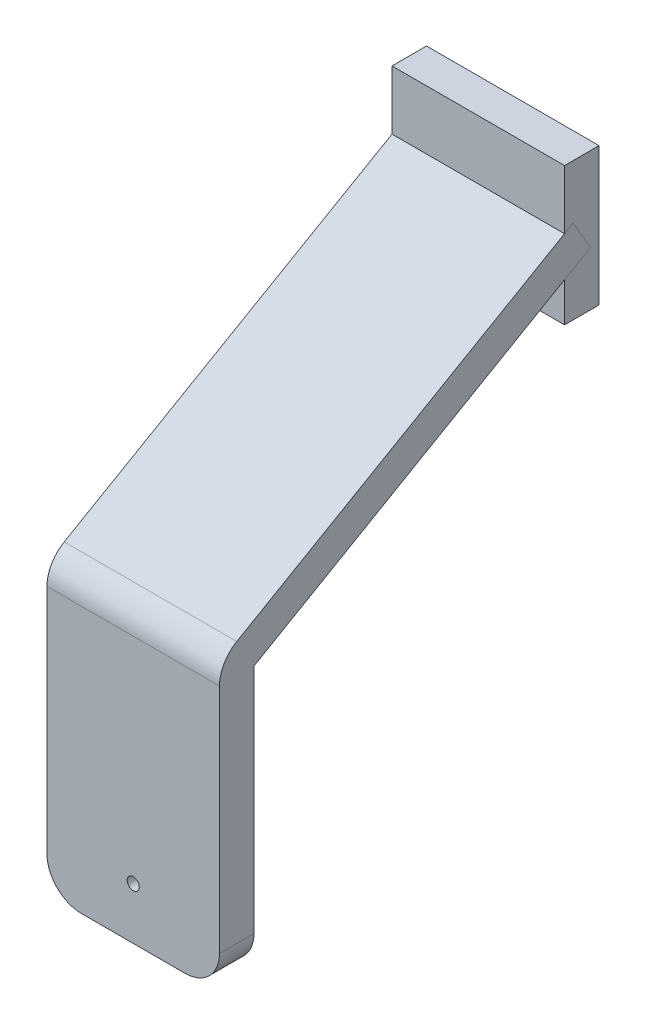
ISO-10303-21;
HEADER;
FILE_DESCRIPTION(('STEP AP214'),'2;1');
FILE_NAME('part.step','',(''),(''),'','','');
FILE_SCHEMA(('AUTOMOTIVE_DESIGN { 1 0 10303 214 1 1 1 1 }'));
ENDSEC;
DATA;
#1=APPLICATION_CONTEXT('core data for automotive mechanical design processes');
#2=APPLICATION_PROTOCOL_DEFINITION('international standard','automotive_design',2000,#1);
#3=PRODUCT_CONTEXT('',#1,'mechanical');
#4=PRODUCT('Part','Part','',(#3));
#5=PRODUCT_RELATED_PRODUCT_CATEGORY('part','',(#4));
#6=PRODUCT_DEFINITION_FORMATION('','',#4);
#7=PRODUCT_DEFINITION_CONTEXT('part definition',#1,'design');
#8=PRODUCT_DEFINITION('design','',#6,#7);
#9=PRODUCT_DEFINITION_SHAPE('','',#8);
#10=(LENGTH_UNIT() NAMED_UNIT(*) SI_UNIT(.MILLI.,.METRE.));
#11=(NAMED_UNIT(*) PLANE_ANGLE_UNIT() SI_UNIT($,.RADIAN.));
#12=(NAMED_UNIT(*) SI_UNIT($,.STERADIAN.) SOLID_ANGLE_UNIT());
#13=UNCERTAINTY_MEASURE_WITH_UNIT(LENGTH_MEASURE(1.E-05),#10,'distance_accuracy_value','');
#14=(GEOMETRIC_REPRESENTATION_CONTEXT(3) GLOBAL_UNCERTAINTY_ASSIGNED_CONTEXT((#13)) GLOBAL_UNIT_ASSIGNED_CONTEXT((#10,
#11,#12)) REPRESENTATION_CONTEXT('',''));
#15=CARTESIAN_POINT('',(0.,0.,0.));
#16=DIRECTION('',(0.,0.,1.));
#17=DIRECTION('',(1.,0.,0.));
#18=AXIS2_PLACEMENT_3D('',#15,#16,#17);
#19=CARTESIAN_POINT('',(50.,117.735026918962,-105.));
#20=DIRECTION('',(0.,0.,1.));
#21=DIRECTION('',(0.,-1.,0.));
#22=AXIS2_PLACEMENT_3D('',#19,#20,#21);
#23=PLANE('',#22);
#24=DIRECTION('',(0.,1.,0.));
#25=VECTOR('',#24,1.);
#26=CARTESIAN_POINT('',(0.,117.735026918962,-105.));
#27=LINE('',#26,#25);
#28=CARTESIAN_POINT('',(0.,117.735026918962,-105.));
#29=VERTEX_POINT('',#28);
#30=CARTESIAN_POINT('',(0.,157.735026918962,-105.));
#31=VERTEX_POINT('',#30);
#32=EDGE_CURVE('E163',#29,#31,#27,.T.);
#33=ORIENTED_EDGE('',*,*,#32,.T.);
#34=DIRECTION('',(-1.,0.,0.));
#35=VECTOR('',#34,1.);
#36=CARTESIAN_POINT('',(50.,157.735026918962,-105.));
#37=LINE('',#36,#35);
#38=CARTESIAN_POINT('',(50.,157.735026918962,-105.));
#39=VERTEX_POINT('',#38);
#40=EDGE_CURVE('E13',#39,#31,#37,.T.);
#41=ORIENTED_EDGE('',*,*,#40,.F.);
#42=DIRECTION('',(0.,1.,0.));
#43=VECTOR('',#42,1.);
#44=CARTESIAN_POINT('',(50.,117.735026918962,-105.));
#45=LINE('',#44,#43);
#46=CARTESIAN_POINT('',(50.,117.735026918962,-105.));
#47=VERTEX_POINT('',#46);
#48=EDGE_CURVE('E143',#47,#39,#45,.T.);
#49=ORIENTED_EDGE('',*,*,#48,.F.);
#50=DIRECTION('',(-1.,0.,0.));
#51=VECTOR('',#50,1.);
#52=CARTESIAN_POINT('',(50.,117.735026918962,-105.));
#53=LINE('',#52,#51);
#54=EDGE_CURVE('E116',#47,#29,#53,.T.);
#55=ORIENTED_EDGE('',*,*,#54,.T.);
#56=EDGE_LOOP('',(#33,#41,#49,#55));
#57=FACE_BOUND('',#56,.T.);
#58=ADVANCED_FACE('F101',(#57),#23,.F.);
#59=CARTESIAN_POINT('',(50.,157.735026918962,-95.));
#60=DIRECTION('',(0.,1.,0.));
#61=DIRECTION('',(0.,0.,1.));
#62=AXIS2_PLACEMENT_3D('',#59,#60,#61);
#63=PLANE('',#62);
#64=DIRECTION('',(0.,0.,-1.));
#65=VECTOR('',#64,1.);
#66=CARTESIAN_POINT('',(0.,157.735026918962,-95.));
#67=LINE('',#66,#65);
#68=CARTESIAN_POINT('',(0.,157.735026918962,-95.));
#69=VERTEX_POINT('',#68);
#70=EDGE_CURVE('E147',#69,#31,#67,.T.);
#71=ORIENTED_EDGE('',*,*,#70,.F.);
#72=DIRECTION('',(-1.,0.,0.));
#73=VECTOR('',#72,1.);
#74=CARTESIAN_POINT('',(50.,157.735026918962,-95.));
#75=LINE('',#74,#73);
#76=CARTESIAN_POINT('',(50.,157.735026918962,-95.));
#77=VERTEX_POINT('',#76);
#78=EDGE_CURVE('E108',#77,#69,#75,.T.);
#79=ORIENTED_EDGE('',*,*,#78,.F.);
#80=DIRECTION('',(0.,0.,-1.));
#81=VECTOR('',#80,1.);
#82=CARTESIAN_POINT('',(50.,157.735026918962,-95.));
#83=LINE('',#82,#81);
#84=EDGE_CURVE('E146',#77,#39,#83,.T.);
#85=ORIENTED_EDGE('',*,*,#84,.T.);
#86=ORIENTED_EDGE('',*,*,#40,.T.);
#87=EDGE_LOOP('',(#71,#79,#85,#86));
#88=FACE_BOUND('',#87,.T.);
#89=ADVANCED_FACE('F150',(#88),#63,.T.);
#90=CARTESIAN_POINT('',(50.,117.735026918962,-95.));
#91=DIRECTION('',(0.,0.,1.));
#92=DIRECTION('',(0.,-1.,0.));
#93=AXIS2_PLACEMENT_3D('',#90,#91,#92);
#94=PLANE('',#93);
#95=DIRECTION('',(0.,1.,0.));
#96=VECTOR('',#95,1.);
#97=CARTESIAN_POINT('',(0.,117.735026918962,-95.));
#98=LINE('',#97,#96);
#99=CARTESIAN_POINT('',(0.,117.735026918962,-95.));
#100=VERTEX_POINT('',#99);
#101=EDGE_CURVE('E170',#100,#69,#98,.T.);
#102=ORIENTED_EDGE('',*,*,#101,.F.);
#103=DIRECTION('',(-1.,0.,0.));
#104=VECTOR('',#103,1.);
#105=CARTESIAN_POINT('',(50.,117.735026918962,-95.));
#106=LINE('',#105,#104);
#107=CARTESIAN_POINT('',(50.,117.735026918962,-95.));
#108=VERTEX_POINT('',#107);
#109=EDGE_CURVE('E128',#108,#100,#106,.T.);
#110=ORIENTED_EDGE('',*,*,#109,.F.);
#111=DIRECTION('',(0.,1.,0.));
#112=VECTOR('',#111,1.);
#113=CARTESIAN_POINT('',(50.,117.735026918962,-95.));
#114=LINE('',#113,#112);
#115=EDGE_CURVE('E156',#108,#77,#114,.T.);
#116=ORIENTED_EDGE('',*,*,#115,.T.);
#117=ORIENTED_EDGE('',*,*,#78,.T.);
#118=EDGE_LOOP('',(#102,#110,#116,#117));
#119=FACE_BOUND('',#118,.T.);
#120=ADVANCED_FACE('F158',(#119),#94,.T.);
#121=CARTESIAN_POINT('',(50.,117.735026918962,-105.));
#122=DIRECTION('',(0.,-1.,0.));
#123=DIRECTION('',(0.,0.,-1.));
#124=AXIS2_PLACEMENT_3D('',#121,#122,#123);
#125=PLANE('',#124);
#126=DIRECTION('',(0.,0.,1.));
#127=VECTOR('',#126,1.);
#128=CARTESIAN_POINT('',(0.,117.735026918962,-105.));
#129=LINE('',#128,#127);
#130=EDGE_CURVE('E166',#29,#100,#129,.T.);
#131=ORIENTED_EDGE('',*,*,#130,.F.);
#132=ORIENTED_EDGE('',*,*,#54,.F.);
#133=DIRECTION('',(0.,0.,1.));
#134=VECTOR('',#133,1.);
#135=CARTESIAN_POINT('',(50.,117.735026918962,-105.));
#136=LINE('',#135,#134);
#137=EDGE_CURVE('E157',#47,#108,#136,.T.);
#138=ORIENTED_EDGE('',*,*,#137,.T.);
#139=ORIENTED_EDGE('',*,*,#109,.T.);
#140=EDGE_LOOP('',(#131,#132,#138,#139));
#141=FACE_BOUND('',#140,.T.);
#142=ADVANCED_FACE('F172',(#141),#125,.T.);
#143=CARTESIAN_POINT('',(50.,0.,0.));
#144=DIRECTION('',(-1.,0.,0.));
#145=DIRECTION('',(0.,-1.,0.));
#146=AXIS2_PLACEMENT_3D('',#143,#144,#145);
#147=PLANE('',#146);
#148=ORIENTED_EDGE('',*,*,#48,.T.);
#149=ORIENTED_EDGE('',*,*,#84,.F.);
#150=ORIENTED_EDGE('',*,*,#115,.F.);
#151=ORIENTED_EDGE('',*,*,#137,.F.);
#152=EDGE_LOOP('',(#148,#149,#150,#151));
#153=FACE_BOUND('',#152,.T.);
#154=ADVANCED_FACE('F154',(#153),#147,.F.);
#155=CARTESIAN_POINT('',(0.,0.,0.));
#156=DIRECTION('',(-1.,0.,0.));
#157=DIRECTION('',(0.,-1.,0.));
#158=AXIS2_PLACEMENT_3D('',#155,#156,#157);
#159=PLANE('',#158);
#160=ORIENTED_EDGE('',*,*,#32,.F.);
#161=ORIENTED_EDGE('',*,*,#130,.T.);
#162=ORIENTED_EDGE('',*,*,#101,.T.);
#163=ORIENTED_EDGE('',*,*,#70,.T.);
#164=EDGE_LOOP('',(#160,#161,#162,#163));
#165=FACE_BOUND('',#164,.T.);
#166=ADVANCED_FACE('F173',(#165),#159,.T.);
#167=CLOSED_SHELL('',(#58,#89,#120,#142,#154,#166));
#168=MANIFOLD_SOLID_BREP('B2',#167);
#169=CARTESIAN_POINT('',(50.,75.6698729810778,-2.49999999999999));
#170=DIRECTION('',(0.,0.86602540378444,0.499999999999998));
#171=DIRECTION('',(0.,-0.499999999999998,0.86602540378444));
#172=AXIS2_PLACEMENT_3D('',#169,#170,#171);
#173=PLANE('',#172);
#174=DIRECTION('',(0.,0.499999999999998,-0.86602540378444));
#175=VECTOR('',#174,1.);
#176=CARTESIAN_POINT('',(0.,75.6698729810778,-2.49999999999999));
#177=LINE('',#176,#175);
#178=CARTESIAN_POINT('',(0.,77.1132486540519,-5.));
#179=VERTEX_POINT('',#178);
#180=CARTESIAN_POINT('',(0.,133.40489990004,-102.5));
#181=VERTEX_POINT('',#180);
#182=EDGE_CURVE('E310',#179,#181,#177,.T.);
#183=ORIENTED_EDGE('',*,*,#182,.T.);
#184=DIRECTION('',(-1.,0.,0.));
#185=VECTOR('',#184,1.);
#186=CARTESIAN_POINT('',(50.,133.40489990004,-102.5));
#187=LINE('',#186,#185);
#188=CARTESIAN_POINT('',(50.,133.40489990004,-102.5));
#189=VERTEX_POINT('',#188);
#190=EDGE_CURVE('E307',#189,#181,#187,.T.);
#191=ORIENTED_EDGE('',*,*,#190,.F.);
#192=DIRECTION('',(0.,0.499999999999998,-0.86602540378444));
#193=VECTOR('',#192,1.);
#194=CARTESIAN_POINT('',(50.,75.6698729810778,-2.49999999999999));
#195=LINE('',#194,#193);
#196=CARTESIAN_POINT('',(50.,77.1132486540519,-5.));
#197=VERTEX_POINT('',#196);
#198=EDGE_CURVE('E294',#197,#189,#195,.T.);
#199=ORIENTED_EDGE('',*,*,#198,.F.);
#200=DIRECTION('',(-1.,0.,0.));
#201=VECTOR('',#200,1.);
#202=CARTESIAN_POINT('',(50.,77.1132486540519,-5.));
#203=LINE('',#202,#201);
#204=EDGE_CURVE('E327',#197,#179,#203,.T.);
#205=ORIENTED_EDGE('',*,*,#204,.T.);
#206=EDGE_LOOP('',(#183,#191,#199,#205));
#207=FACE_BOUND('',#206,.T.);
#208=ADVANCED_FACE('F223',(#207),#173,.F.);
#209=CARTESIAN_POINT('',(50.,142.065153937885,-97.5));
#210=DIRECTION('',(0.,0.499999999999997,-0.866025403784441));
#211=DIRECTION('',(0.,0.866025403784441,0.499999999999997));
#212=AXIS2_PLACEMENT_3D('',#209,#210,#211);
#213=PLANE('',#212);
#214=DIRECTION('',(0.,-0.866025403784441,-0.499999999999996));
#215=VECTOR('',#214,1.);
#216=CARTESIAN_POINT('',(0.,142.065153937885,-97.5));
#217=LINE('',#216,#215);
#218=CARTESIAN_POINT('',(0.,142.065153937885,-97.5));
#219=VERTEX_POINT('',#218);
#220=EDGE_CURVE('E329',#219,#181,#217,.T.);
#221=ORIENTED_EDGE('',*,*,#220,.F.);
#222=DIRECTION('',(-1.,0.,0.));
#223=VECTOR('',#222,1.);
#224=CARTESIAN_POINT('',(50.,142.065153937885,-97.5));
#225=LINE('',#224,#223);
#226=CARTESIAN_POINT('',(50.,142.065153937885,-97.5));
#227=VERTEX_POINT('',#226);
#228=EDGE_CURVE('E314',#227,#219,#225,.T.);
#229=ORIENTED_EDGE('',*,*,#228,.F.);
#230=DIRECTION('',(0.,-0.866025403784441,-0.499999999999996));
#231=VECTOR('',#230,1.);
#232=CARTESIAN_POINT('',(50.,142.065153937885,-97.5));
#233=LINE('',#232,#231);
#234=EDGE_CURVE('E300',#227,#189,#233,.T.);
#235=ORIENTED_EDGE('',*,*,#234,.T.);
#236=ORIENTED_EDGE('',*,*,#190,.T.);
#237=EDGE_LOOP('',(#221,#229,#235,#236));
#238=FACE_BOUND('',#237,.T.);
#239=ADVANCED_FACE('F320',(#238),#213,.T.);
#240=CARTESIAN_POINT('',(50.,84.3301270189222,2.49999999999999));
#241=DIRECTION('',(0.,0.86602540378444,0.499999999999998));
#242=DIRECTION('',(0.,-0.499999999999998,0.86602540378444));
#243=AXIS2_PLACEMENT_3D('',#240,#241,#242);
#244=PLANE('',#243);
#245=DIRECTION('',(0.,0.499999999999998,-0.86602540378444));
#246=VECTOR('',#245,1.);
#247=CARTESIAN_POINT('',(0.,84.3301270189222,2.49999999999999));
#248=LINE('',#247,#246);
#249=CARTESIAN_POINT('',(0.,85.7735026918963,0.));
#250=VERTEX_POINT('',#249);
#251=EDGE_CURVE('E334',#250,#219,#248,.T.);
#252=ORIENTED_EDGE('',*,*,#251,.F.);
#253=DIRECTION('',(-1.,0.,0.));
#254=VECTOR('',#253,1.);
#255=CARTESIAN_POINT('',(50.,85.7735026918963,0.));
#256=LINE('',#255,#254);
#257=CARTESIAN_POINT('',(50.,85.7735026918963,0.));
#258=VERTEX_POINT('',#257);
#259=EDGE_CURVE('E231',#250,#258,#256,.F.);
#260=ORIENTED_EDGE('',*,*,#259,.T.);
#261=DIRECTION('',(0.,0.499999999999998,-0.86602540378444));
#262=VECTOR('',#261,1.);
#263=CARTESIAN_POINT('',(50.,84.3301270189222,2.49999999999999));
#264=LINE('',#263,#262);
#265=EDGE_CURVE('E317',#258,#227,#264,.T.);
#266=ORIENTED_EDGE('',*,*,#265,.T.);
#267=ORIENTED_EDGE('',*,*,#228,.T.);
#268=EDGE_LOOP('',(#252,#260,#266,#267));
#269=FACE_BOUND('',#268,.T.);
#270=ADVANCED_FACE('F404',(#269),#244,.T.);
#271=CARTESIAN_POINT('',(50.,0.,5.));
#272=DIRECTION('',(0.,0.,1.));
#273=DIRECTION('',(1.,0.,0.));
#274=AXIS2_PLACEMENT_3D('',#271,#272,#273);
#275=PLANE('',#274);
#276=CARTESIAN_POINT('',(25.,15.,5.));
#277=DIRECTION('',(0.,0.,1.));
#278=DIRECTION('',(1.,0.,0.));
#279=AXIS2_PLACEMENT_3D('',#276,#277,#278);
#280=CIRCLE('',#279,1.75);
#281=CARTESIAN_POINT('',(26.75,15.,5.));
#282=VERTEX_POINT('',#281);
#283=EDGE_CURVE('E332',#282,#282,#280,.T.);
#284=ORIENTED_EDGE('',*,*,#283,.F.);
#285=EDGE_LOOP('',(#284));
#286=FACE_BOUND('',#285,.T.);
#287=DIRECTION('',(0.,1.,0.));
#288=VECTOR('',#287,1.);
#289=CARTESIAN_POINT('',(50.,0.,5.));
#290=LINE('',#289,#288);
#291=CARTESIAN_POINT('',(50.,10.,5.));
#292=VERTEX_POINT('',#291);
#293=CARTESIAN_POINT('',(50.,77.1132486540519,5.));
#294=VERTEX_POINT('',#293);
#295=EDGE_CURVE('E321',#292,#294,#290,.T.);
#296=ORIENTED_EDGE('',*,*,#295,.T.);
#297=DIRECTION('',(-1.,0.,0.));
#298=VECTOR('',#297,1.);
#299=CARTESIAN_POINT('',(50.,77.1132486540519,5.));
#300=LINE('',#299,#298);
#301=CARTESIAN_POINT('',(0.,77.1132486540519,5.));
#302=VERTEX_POINT('',#301);
#303=EDGE_CURVE('E361',#294,#302,#300,.T.);
#304=ORIENTED_EDGE('',*,*,#303,.T.);
#305=DIRECTION('',(0.,1.,0.));
#306=VECTOR('',#305,1.);
#307=CARTESIAN_POINT('',(0.,0.,5.));
#308=LINE('',#307,#306);
#309=CARTESIAN_POINT('',(0.,10.,5.));
#310=VERTEX_POINT('',#309);
#311=EDGE_CURVE('E333',#310,#302,#308,.T.);
#312=ORIENTED_EDGE('',*,*,#311,.F.);
#313=CARTESIAN_POINT('',(10.,10.,5.));
#314=DIRECTION('',(0.,0.,1.));
#315=DIRECTION('',(1.,0.,0.));
#316=AXIS2_PLACEMENT_3D('',#313,#314,#315);
#317=CIRCLE('',#316,10.);
#318=CARTESIAN_POINT('',(10.,0.,5.));
#319=VERTEX_POINT('',#318);
#320=EDGE_CURVE('E348',#310,#319,#317,.T.);
#321=ORIENTED_EDGE('',*,*,#320,.T.);
#322=DIRECTION('',(-1.,0.,0.));
#323=VECTOR('',#322,1.);
#324=CARTESIAN_POINT('',(50.,0.,5.));
#325=LINE('',#324,#323);
#326=CARTESIAN_POINT('',(40.,0.,5.));
#327=VERTEX_POINT('',#326);
#328=EDGE_CURVE('E345',#327,#319,#325,.T.);
#329=ORIENTED_EDGE('',*,*,#328,.F.);
#330=CARTESIAN_POINT('',(40.,10.,5.));
#331=DIRECTION('',(0.,0.,1.));
#332=DIRECTION('',(1.,0.,0.));
#333=AXIS2_PLACEMENT_3D('',#330,#331,#332);
#334=CIRCLE('',#333,10.);
#335=EDGE_CURVE('E346',#327,#292,#334,.T.);
#336=ORIENTED_EDGE('',*,*,#335,.T.);
#337=EDGE_LOOP('',(#296,#304,#312,#321,#329,#336));
#338=FACE_BOUND('',#337,.T.);
#339=ADVANCED_FACE('F369',(#286,#338),#275,.T.);
#340=CARTESIAN_POINT('',(50.,0.,-5.));
#341=DIRECTION('',(0.,-1.,0.));
#342=DIRECTION('',(0.,0.,-1.));
#343=AXIS2_PLACEMENT_3D('',#340,#341,#342);
#344=PLANE('',#343);
#345=ORIENTED_EDGE('',*,*,#328,.T.);
#346=DIRECTION('',(0.,0.,1.));
#347=VECTOR('',#346,1.);
#348=CARTESIAN_POINT('',(10.,0.,-5.));
#349=LINE('',#348,#347);
#350=CARTESIAN_POINT('',(10.,0.,-5.));
#351=VERTEX_POINT('',#350);
#352=EDGE_CURVE('E352',#319,#351,#349,.F.);
#353=ORIENTED_EDGE('',*,*,#352,.T.);
#354=DIRECTION('',(-1.,0.,0.));
#355=VECTOR('',#354,1.);
#356=CARTESIAN_POINT('',(50.,0.,-5.));
#357=LINE('',#356,#355);
#358=CARTESIAN_POINT('',(40.,0.,-5.));
#359=VERTEX_POINT('',#358);
#360=EDGE_CURVE('E338',#359,#351,#357,.T.);
#361=ORIENTED_EDGE('',*,*,#360,.F.);
#362=DIRECTION('',(0.,0.,1.));
#363=VECTOR('',#362,1.);
#364=CARTESIAN_POINT('',(40.,0.,5.));
#365=LINE('',#364,#363);
#366=EDGE_CURVE('E351',#359,#327,#365,.T.);
#367=ORIENTED_EDGE('',*,*,#366,.T.);
#368=EDGE_LOOP('',(#345,#353,#361,#367));
#369=FACE_BOUND('',#368,.T.);
#370=ADVANCED_FACE('F385',(#369),#344,.T.);
#371=CARTESIAN_POINT('',(50.,0.,-5.));
#372=DIRECTION('',(0.,0.,1.));
#373=DIRECTION('',(1.,0.,0.));
#374=AXIS2_PLACEMENT_3D('',#371,#372,#373);
#375=PLANE('',#374);
#376=CARTESIAN_POINT('',(25.,15.,-5.));
#377=DIRECTION('',(0.,0.,1.));
#378=DIRECTION('',(1.,0.,0.));
#379=AXIS2_PLACEMENT_3D('',#376,#377,#378);
#380=CIRCLE('',#379,1.75);
#381=CARTESIAN_POINT('',(26.75,15.,-5.));
#382=VERTEX_POINT('',#381);
#383=EDGE_CURVE('E491',#382,#382,#380,.F.);
#384=ORIENTED_EDGE('',*,*,#383,.F.);
#385=EDGE_LOOP('',(#384));
#386=FACE_BOUND('',#385,.T.);
#387=ORIENTED_EDGE('',*,*,#360,.T.);
#388=CARTESIAN_POINT('',(10.,10.,-5.));
#389=DIRECTION('',(0.,0.,1.));
#390=DIRECTION('',(1.,0.,0.));
#391=AXIS2_PLACEMENT_3D('',#388,#389,#390);
#392=CIRCLE('',#391,10.);
#393=CARTESIAN_POINT('',(0.,10.,-5.));
#394=VERTEX_POINT('',#393);
#395=EDGE_CURVE('E359',#351,#394,#392,.F.);
#396=ORIENTED_EDGE('',*,*,#395,.T.);
#397=DIRECTION('',(0.,1.,0.));
#398=VECTOR('',#397,1.);
#399=CARTESIAN_POINT('',(0.,0.,-5.));
#400=LINE('',#399,#398);
#401=EDGE_CURVE('E304',#394,#179,#400,.T.);
#402=ORIENTED_EDGE('',*,*,#401,.T.);
#403=ORIENTED_EDGE('',*,*,#204,.F.);
#404=DIRECTION('',(0.,1.,0.));
#405=VECTOR('',#404,1.);
#406=CARTESIAN_POINT('',(50.,0.,-5.));
#407=LINE('',#406,#405);
#408=CARTESIAN_POINT('',(50.,10.,-5.));
#409=VERTEX_POINT('',#408);
#410=EDGE_CURVE('E297',#409,#197,#407,.T.);
#411=ORIENTED_EDGE('',*,*,#410,.F.);
#412=CARTESIAN_POINT('',(40.,10.,-5.));
#413=DIRECTION('',(0.,0.,1.));
#414=DIRECTION('',(1.,0.,0.));
#415=AXIS2_PLACEMENT_3D('',#412,#413,#414);
#416=CIRCLE('',#415,10.);
#417=EDGE_CURVE('E360',#409,#359,#416,.F.);
#418=ORIENTED_EDGE('',*,*,#417,.T.);
#419=EDGE_LOOP('',(#387,#396,#402,#403,#411,#418));
#420=FACE_BOUND('',#419,.T.);
#421=ADVANCED_FACE('F418',(#386,#420),#375,.F.);
#422=CARTESIAN_POINT('',(50.,0.,0.));
#423=DIRECTION('',(-1.,0.,0.));
#424=DIRECTION('',(0.,-1.,0.));
#425=AXIS2_PLACEMENT_3D('',#422,#423,#424);
#426=PLANE('',#425);
#427=ORIENTED_EDGE('',*,*,#265,.F.);
#428=CARTESIAN_POINT('',(50.,77.1132486540519,-5.));
#429=DIRECTION('',(-1.,0.,0.));
#430=DIRECTION('',(0.,0.,1.));
#431=AXIS2_PLACEMENT_3D('',#428,#429,#430);
#432=CIRCLE('',#431,10.);
#433=EDGE_CURVE('E97',#258,#294,#432,.F.);
#434=ORIENTED_EDGE('',*,*,#433,.T.);
#435=ORIENTED_EDGE('',*,*,#295,.F.);
#436=DIRECTION('',(0.,0.,1.));
#437=VECTOR('',#436,1.);
#438=CARTESIAN_POINT('',(50.,10.,-5.));
#439=LINE('',#438,#437);
#440=EDGE_CURVE('E363',#292,#409,#439,.F.);
#441=ORIENTED_EDGE('',*,*,#440,.T.);
#442=ORIENTED_EDGE('',*,*,#410,.T.);
#443=ORIENTED_EDGE('',*,*,#198,.T.);
#444=ORIENTED_EDGE('',*,*,#234,.F.);
#445=EDGE_LOOP('',(#427,#434,#435,#441,#442,#443,#444));
#446=FACE_BOUND('',#445,.T.);
#447=ADVANCED_FACE('F299',(#446),#426,.F.);
#448=CARTESIAN_POINT('',(0.,0.,0.));
#449=DIRECTION('',(-1.,0.,0.));
#450=DIRECTION('',(0.,-1.,0.));
#451=AXIS2_PLACEMENT_3D('',#448,#449,#450);
#452=PLANE('',#451);
#453=ORIENTED_EDGE('',*,*,#311,.T.);
#454=CARTESIAN_POINT('',(0.,77.1132486540519,-5.));
#455=DIRECTION('',(-1.,0.,0.));
#456=DIRECTION('',(0.,0.,1.));
#457=AXIS2_PLACEMENT_3D('',#454,#455,#456);
#458=CIRCLE('',#457,10.);
#459=EDGE_CURVE('E250',#302,#250,#458,.T.);
#460=ORIENTED_EDGE('',*,*,#459,.T.);
#461=ORIENTED_EDGE('',*,*,#251,.T.);
#462=ORIENTED_EDGE('',*,*,#220,.T.);
#463=ORIENTED_EDGE('',*,*,#182,.F.);
#464=ORIENTED_EDGE('',*,*,#401,.F.);
#465=DIRECTION('',(0.,0.,1.));
#466=VECTOR('',#465,1.);
#467=CARTESIAN_POINT('',(0.,10.,0.));
#468=LINE('',#467,#466);
#469=EDGE_CURVE('E311',#394,#310,#468,.T.);
#470=ORIENTED_EDGE('',*,*,#469,.T.);
#471=EDGE_LOOP('',(#453,#460,#461,#462,#463,#464,#470));
#472=FACE_BOUND('',#471,.T.);
#473=ADVANCED_FACE('F373',(#472),#452,.T.);
#474=CARTESIAN_POINT('',(10.,10.,0.));
#475=DIRECTION('',(0.,0.,1.));
#476=DIRECTION('',(1.,0.,0.));
#477=AXIS2_PLACEMENT_3D('',#474,#475,#476);
#478=CYLINDRICAL_SURFACE('',#477,10.);
#479=ORIENTED_EDGE('',*,*,#395,.F.);
#480=ORIENTED_EDGE('',*,*,#352,.F.);
#481=ORIENTED_EDGE('',*,*,#320,.F.);
#482=ORIENTED_EDGE('',*,*,#469,.F.);
#483=EDGE_LOOP('',(#479,#480,#481,#482));
#484=FACE_BOUND('',#483,.T.);
#485=ADVANCED_FACE('F378',(#484),#478,.T.);
#486=CARTESIAN_POINT('',(40.,10.,-5.));
#487=DIRECTION('',(0.,0.,-1.));
#488=DIRECTION('',(-1.,0.,0.));
#489=AXIS2_PLACEMENT_3D('',#486,#487,#488);
#490=CYLINDRICAL_SURFACE('',#489,10.);
#491=ORIENTED_EDGE('',*,*,#417,.F.);
#492=ORIENTED_EDGE('',*,*,#440,.F.);
#493=ORIENTED_EDGE('',*,*,#335,.F.);
#494=ORIENTED_EDGE('',*,*,#366,.F.);
#495=EDGE_LOOP('',(#491,#492,#493,#494));
#496=FACE_BOUND('',#495,.T.);
#497=ADVANCED_FACE('F390',(#496),#490,.T.);
#498=CARTESIAN_POINT('',(50.,77.1132486540519,-5.));
#499=DIRECTION('',(-1.,0.,0.));
#500=DIRECTION('',(0.,0.,1.));
#501=AXIS2_PLACEMENT_3D('',#498,#499,#500);
#502=CYLINDRICAL_SURFACE('',#501,10.);
#503=ORIENTED_EDGE('',*,*,#433,.F.);
#504=ORIENTED_EDGE('',*,*,#259,.F.);
#505=ORIENTED_EDGE('',*,*,#459,.F.);
#506=ORIENTED_EDGE('',*,*,#303,.F.);
#507=EDGE_LOOP('',(#503,#504,#505,#506));
#508=FACE_BOUND('',#507,.T.);
#509=ADVANCED_FACE('F226',(#508),#502,.T.);
#510=CARTESIAN_POINT('',(25.,15.,5.));
#511=DIRECTION('',(0.,0.,-1.));
#512=DIRECTION('',(-1.,0.,0.));
#513=AXIS2_PLACEMENT_3D('',#510,#511,#512);
#514=CYLINDRICAL_SURFACE('',#513,1.75);
#515=ORIENTED_EDGE('',*,*,#283,.T.);
#516=EDGE_LOOP('',(#515));
#517=FACE_BOUND('',#516,.T.);
#518=ORIENTED_EDGE('',*,*,#383,.T.);
#519=EDGE_LOOP('',(#518));
#520=FACE_BOUND('',#519,.T.);
#521=ADVANCED_FACE('F388',(#517,#520),#514,.F.);
#522=CLOSED_SHELL('',(#208,#239,#270,#339,#370,#421,#447,#473,#485,#497,#509,#521));
#523=MANIFOLD_SOLID_BREP('B7',#522);
#524=ADVANCED_BREP_SHAPE_REPRESENTATION('',(#18,#168,#523),#14);
#525=SHAPE_DEFINITION_REPRESENTATION(#9,#524);
ENDSEC;
END-ISO-10303-21;
